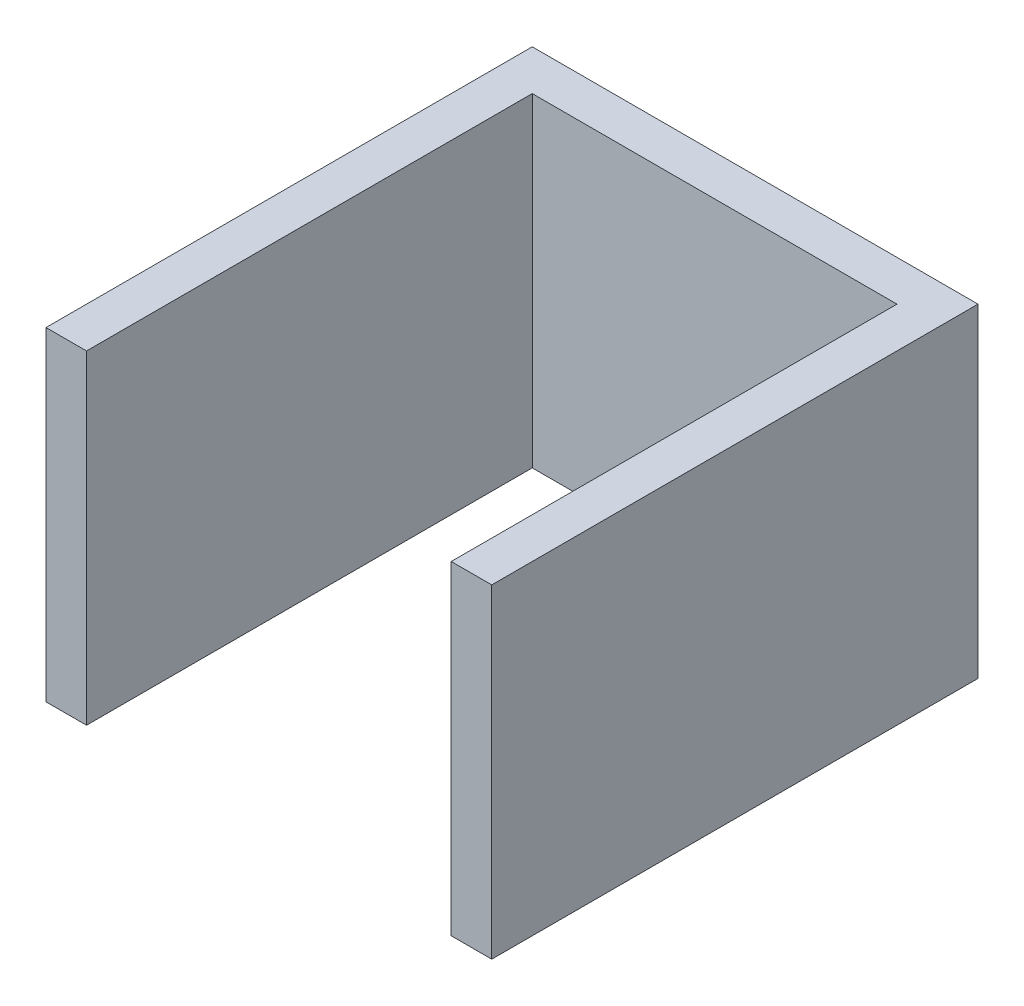
ISO-10303-21;
HEADER;
FILE_DESCRIPTION(('STEP AP214'),'2;1');
FILE_NAME('part.step','',(''),(''),'','','');
FILE_SCHEMA(('AUTOMOTIVE_DESIGN { 1 0 10303 214 1 1 1 1 }'));
ENDSEC;
DATA;
#1=APPLICATION_CONTEXT('core data for automotive mechanical design processes');
#2=APPLICATION_PROTOCOL_DEFINITION('international standard','automotive_design',2000,#1);
#3=PRODUCT_CONTEXT('',#1,'mechanical');
#4=PRODUCT('Part','Part','',(#3));
#5=PRODUCT_RELATED_PRODUCT_CATEGORY('part','',(#4));
#6=PRODUCT_DEFINITION_FORMATION('','',#4);
#7=PRODUCT_DEFINITION_CONTEXT('part definition',#1,'design');
#8=PRODUCT_DEFINITION('design','',#6,#7);
#9=PRODUCT_DEFINITION_SHAPE('','',#8);
#10=(LENGTH_UNIT() NAMED_UNIT(*) SI_UNIT(.MILLI.,.METRE.));
#11=(NAMED_UNIT(*) PLANE_ANGLE_UNIT() SI_UNIT($,.RADIAN.));
#12=(NAMED_UNIT(*) SI_UNIT($,.STERADIAN.) SOLID_ANGLE_UNIT());
#13=UNCERTAINTY_MEASURE_WITH_UNIT(LENGTH_MEASURE(1.E-05),#10,'distance_accuracy_value','');
#14=(GEOMETRIC_REPRESENTATION_CONTEXT(3) GLOBAL_UNCERTAINTY_ASSIGNED_CONTEXT((#13)) GLOBAL_UNIT_ASSIGNED_CONTEXT((#10,
#11,#12)) REPRESENTATION_CONTEXT('',''));
#15=CARTESIAN_POINT('',(0.,0.,0.));
#16=DIRECTION('',(0.,0.,1.));
#17=DIRECTION('',(1.,0.,0.));
#18=AXIS2_PLACEMENT_3D('',#15,#16,#17);
#19=CARTESIAN_POINT('',(-9.99999999999999,80.,0.));
#20=DIRECTION('',(0.,0.,-1.));
#21=DIRECTION('',(-1.,0.,0.));
#22=AXIS2_PLACEMENT_3D('',#19,#20,#21);
#23=PLANE('',#22);
#24=DIRECTION('',(1.,0.,0.));
#25=VECTOR('',#24,1.);
#26=CARTESIAN_POINT('',(-9.99999999999999,0.,0.));
#27=LINE('',#26,#25);
#28=CARTESIAN_POINT('',(-9.99999999999999,0.,0.));
#29=VERTEX_POINT('',#28);
#30=CARTESIAN_POINT('',(0.,0.,0.));
#31=VERTEX_POINT('',#30);
#32=EDGE_CURVE('E140',#29,#31,#27,.T.);
#33=ORIENTED_EDGE('',*,*,#32,.T.);
#34=DIRECTION('',(0.,-1.,0.));
#35=VECTOR('',#34,1.);
#36=CARTESIAN_POINT('',(0.,80.,0.));
#37=LINE('',#36,#35);
#38=CARTESIAN_POINT('',(0.,80.,0.));
#39=VERTEX_POINT('',#38);
#40=EDGE_CURVE('E11',#39,#31,#37,.T.);
#41=ORIENTED_EDGE('',*,*,#40,.F.);
#42=DIRECTION('',(1.,0.,0.));
#43=VECTOR('',#42,1.);
#44=CARTESIAN_POINT('',(-9.99999999999999,80.,0.));
#45=LINE('',#44,#43);
#46=CARTESIAN_POINT('',(-9.99999999999999,80.,0.));
#47=VERTEX_POINT('',#46);
#48=EDGE_CURVE('E162',#47,#39,#45,.T.);
#49=ORIENTED_EDGE('',*,*,#48,.F.);
#50=DIRECTION('',(0.,-1.,0.));
#51=VECTOR('',#50,1.);
#52=CARTESIAN_POINT('',(-9.99999999999999,80.,0.));
#53=LINE('',#52,#51);
#54=EDGE_CURVE('E136',#47,#29,#53,.T.);
#55=ORIENTED_EDGE('',*,*,#54,.T.);
#56=EDGE_LOOP('',(#33,#41,#49,#55));
#57=FACE_BOUND('',#56,.T.);
#58=ADVANCED_FACE('F39',(#57),#23,.F.);
#59=CARTESIAN_POINT('',(0.,80.,0.));
#60=DIRECTION('',(-1.,0.,0.));
#61=DIRECTION('',(0.,0.,1.));
#62=AXIS2_PLACEMENT_3D('',#59,#60,#61);
#63=PLANE('',#62);
#64=DIRECTION('',(0.,0.,-1.));
#65=VECTOR('',#64,1.);
#66=CARTESIAN_POINT('',(0.,0.,0.));
#67=LINE('',#66,#65);
#68=CARTESIAN_POINT('',(0.,0.,-120.));
#69=VERTEX_POINT('',#68);
#70=EDGE_CURVE('E144',#31,#69,#67,.T.);
#71=ORIENTED_EDGE('',*,*,#70,.T.);
#72=DIRECTION('',(0.,-1.,0.));
#73=VECTOR('',#72,1.);
#74=CARTESIAN_POINT('',(0.,80.,-120.));
#75=LINE('',#74,#73);
#76=CARTESIAN_POINT('',(0.,80.,-120.));
#77=VERTEX_POINT('',#76);
#78=EDGE_CURVE('E48',#77,#69,#75,.T.);
#79=ORIENTED_EDGE('',*,*,#78,.F.);
#80=DIRECTION('',(0.,0.,-1.));
#81=VECTOR('',#80,1.);
#82=CARTESIAN_POINT('',(0.,80.,0.));
#83=LINE('',#82,#81);
#84=EDGE_CURVE('E99',#39,#77,#83,.T.);
#85=ORIENTED_EDGE('',*,*,#84,.F.);
#86=ORIENTED_EDGE('',*,*,#40,.T.);
#87=EDGE_LOOP('',(#71,#79,#85,#86));
#88=FACE_BOUND('',#87,.T.);
#89=ADVANCED_FACE('F208',(#88),#63,.F.);
#90=CARTESIAN_POINT('',(0.,80.,-120.));
#91=DIRECTION('',(0.,0.,1.));
#92=DIRECTION('',(1.,0.,0.));
#93=AXIS2_PLACEMENT_3D('',#90,#91,#92);
#94=PLANE('',#93);
#95=DIRECTION('',(-1.,0.,0.));
#96=VECTOR('',#95,1.);
#97=CARTESIAN_POINT('',(0.,0.,-120.));
#98=LINE('',#97,#96);
#99=CARTESIAN_POINT('',(-110.,0.,-120.));
#100=VERTEX_POINT('',#99);
#101=EDGE_CURVE('E147',#69,#100,#98,.T.);
#102=ORIENTED_EDGE('',*,*,#101,.T.);
#103=DIRECTION('',(0.,-1.,0.));
#104=VECTOR('',#103,1.);
#105=CARTESIAN_POINT('',(-110.,80.,-120.));
#106=LINE('',#105,#104);
#107=CARTESIAN_POINT('',(-110.,80.,-120.));
#108=VERTEX_POINT('',#107);
#109=EDGE_CURVE('E173',#108,#100,#106,.T.);
#110=ORIENTED_EDGE('',*,*,#109,.F.);
#111=DIRECTION('',(-1.,0.,0.));
#112=VECTOR('',#111,1.);
#113=CARTESIAN_POINT('',(0.,80.,-120.));
#114=LINE('',#113,#112);
#115=EDGE_CURVE('E183',#77,#108,#114,.T.);
#116=ORIENTED_EDGE('',*,*,#115,.F.);
#117=ORIENTED_EDGE('',*,*,#78,.T.);
#118=EDGE_LOOP('',(#102,#110,#116,#117));
#119=FACE_BOUND('',#118,.T.);
#120=ADVANCED_FACE('F181',(#119),#94,.F.);
#121=CARTESIAN_POINT('',(-110.,80.,-120.));
#122=DIRECTION('',(1.,0.,0.));
#123=DIRECTION('',(0.,0.,-1.));
#124=AXIS2_PLACEMENT_3D('',#121,#122,#123);
#125=PLANE('',#124);
#126=DIRECTION('',(0.,0.,1.));
#127=VECTOR('',#126,1.);
#128=CARTESIAN_POINT('',(-110.,0.,-120.));
#129=LINE('',#128,#127);
#130=CARTESIAN_POINT('',(-110.,0.,0.));
#131=VERTEX_POINT('',#130);
#132=EDGE_CURVE('E150',#100,#131,#129,.T.);
#133=ORIENTED_EDGE('',*,*,#132,.T.);
#134=DIRECTION('',(0.,-1.,0.));
#135=VECTOR('',#134,1.);
#136=CARTESIAN_POINT('',(-110.,80.,0.));
#137=LINE('',#136,#135);
#138=CARTESIAN_POINT('',(-110.,80.,0.));
#139=VERTEX_POINT('',#138);
#140=EDGE_CURVE('E169',#139,#131,#137,.T.);
#141=ORIENTED_EDGE('',*,*,#140,.F.);
#142=DIRECTION('',(0.,0.,1.));
#143=VECTOR('',#142,1.);
#144=CARTESIAN_POINT('',(-110.,80.,-120.));
#145=LINE('',#144,#143);
#146=EDGE_CURVE('E196',#108,#139,#145,.T.);
#147=ORIENTED_EDGE('',*,*,#146,.F.);
#148=ORIENTED_EDGE('',*,*,#109,.T.);
#149=EDGE_LOOP('',(#133,#141,#147,#148));
#150=FACE_BOUND('',#149,.T.);
#151=ADVANCED_FACE('F191',(#150),#125,.F.);
#152=CARTESIAN_POINT('',(-110.,80.,0.));
#153=DIRECTION('',(0.,0.,-1.));
#154=DIRECTION('',(-1.,0.,0.));
#155=AXIS2_PLACEMENT_3D('',#152,#153,#154);
#156=PLANE('',#155);
#157=DIRECTION('',(1.,0.,0.));
#158=VECTOR('',#157,1.);
#159=CARTESIAN_POINT('',(-110.,0.,0.));
#160=LINE('',#159,#158);
#161=CARTESIAN_POINT('',(-100.,0.,0.));
#162=VERTEX_POINT('',#161);
#163=EDGE_CURVE('E153',#131,#162,#160,.T.);
#164=ORIENTED_EDGE('',*,*,#163,.T.);
#165=DIRECTION('',(0.,-1.,0.));
#166=VECTOR('',#165,1.);
#167=CARTESIAN_POINT('',(-100.,80.,0.));
#168=LINE('',#167,#166);
#169=CARTESIAN_POINT('',(-100.,80.,0.));
#170=VERTEX_POINT('',#169);
#171=EDGE_CURVE('E129',#170,#162,#168,.T.);
#172=ORIENTED_EDGE('',*,*,#171,.F.);
#173=DIRECTION('',(1.,0.,0.));
#174=VECTOR('',#173,1.);
#175=CARTESIAN_POINT('',(-110.,80.,0.));
#176=LINE('',#175,#174);
#177=EDGE_CURVE('E118',#139,#170,#176,.T.);
#178=ORIENTED_EDGE('',*,*,#177,.F.);
#179=ORIENTED_EDGE('',*,*,#140,.T.);
#180=EDGE_LOOP('',(#164,#172,#178,#179));
#181=FACE_BOUND('',#180,.T.);
#182=ADVANCED_FACE('F194',(#181),#156,.F.);
#183=CARTESIAN_POINT('',(-100.,80.,0.));
#184=DIRECTION('',(-1.,0.,0.));
#185=DIRECTION('',(0.,0.,1.));
#186=AXIS2_PLACEMENT_3D('',#183,#184,#185);
#187=PLANE('',#186);
#188=DIRECTION('',(0.,0.,-1.));
#189=VECTOR('',#188,1.);
#190=CARTESIAN_POINT('',(-100.,0.,0.));
#191=LINE('',#190,#189);
#192=CARTESIAN_POINT('',(-100.,0.,-110.));
#193=VERTEX_POINT('',#192);
#194=EDGE_CURVE('E127',#162,#193,#191,.T.);
#195=ORIENTED_EDGE('',*,*,#194,.T.);
#196=DIRECTION('',(0.,-1.,0.));
#197=VECTOR('',#196,1.);
#198=CARTESIAN_POINT('',(-100.,80.,-110.));
#199=LINE('',#198,#197);
#200=CARTESIAN_POINT('',(-100.,80.,-110.));
#201=VERTEX_POINT('',#200);
#202=EDGE_CURVE('E124',#201,#193,#199,.T.);
#203=ORIENTED_EDGE('',*,*,#202,.F.);
#204=DIRECTION('',(0.,0.,-1.));
#205=VECTOR('',#204,1.);
#206=CARTESIAN_POINT('',(-100.,80.,0.));
#207=LINE('',#206,#205);
#208=EDGE_CURVE('E112',#170,#201,#207,.T.);
#209=ORIENTED_EDGE('',*,*,#208,.F.);
#210=ORIENTED_EDGE('',*,*,#171,.T.);
#211=EDGE_LOOP('',(#195,#203,#209,#210));
#212=FACE_BOUND('',#211,.T.);
#213=ADVANCED_FACE('F125',(#212),#187,.F.);
#214=CARTESIAN_POINT('',(-100.,80.,-110.));
#215=DIRECTION('',(0.,0.,-1.));
#216=DIRECTION('',(-1.,0.,0.));
#217=AXIS2_PLACEMENT_3D('',#214,#215,#216);
#218=PLANE('',#217);
#219=DIRECTION('',(1.,0.,0.));
#220=VECTOR('',#219,1.);
#221=CARTESIAN_POINT('',(-100.,0.,-110.));
#222=LINE('',#221,#220);
#223=CARTESIAN_POINT('',(-9.99999999999999,0.,-110.));
#224=VERTEX_POINT('',#223);
#225=EDGE_CURVE('E85',#193,#224,#222,.T.);
#226=ORIENTED_EDGE('',*,*,#225,.T.);
#227=DIRECTION('',(0.,-1.,0.));
#228=VECTOR('',#227,1.);
#229=CARTESIAN_POINT('',(-9.99999999999999,80.,-110.));
#230=LINE('',#229,#228);
#231=CARTESIAN_POINT('',(-9.99999999999999,80.,-110.));
#232=VERTEX_POINT('',#231);
#233=EDGE_CURVE('E130',#232,#224,#230,.T.);
#234=ORIENTED_EDGE('',*,*,#233,.F.);
#235=DIRECTION('',(1.,0.,0.));
#236=VECTOR('',#235,1.);
#237=CARTESIAN_POINT('',(-100.,80.,-110.));
#238=LINE('',#237,#236);
#239=EDGE_CURVE('E116',#201,#232,#238,.T.);
#240=ORIENTED_EDGE('',*,*,#239,.F.);
#241=ORIENTED_EDGE('',*,*,#202,.T.);
#242=EDGE_LOOP('',(#226,#234,#240,#241));
#243=FACE_BOUND('',#242,.T.);
#244=ADVANCED_FACE('F132',(#243),#218,.F.);
#245=CARTESIAN_POINT('',(-9.99999999999999,80.,-110.));
#246=DIRECTION('',(1.,0.,0.));
#247=DIRECTION('',(0.,0.,-1.));
#248=AXIS2_PLACEMENT_3D('',#245,#246,#247);
#249=PLANE('',#248);
#250=DIRECTION('',(0.,0.,1.));
#251=VECTOR('',#250,1.);
#252=CARTESIAN_POINT('',(-9.99999999999999,0.,-110.));
#253=LINE('',#252,#251);
#254=EDGE_CURVE('E91',#224,#29,#253,.T.);
#255=ORIENTED_EDGE('',*,*,#254,.T.);
#256=ORIENTED_EDGE('',*,*,#54,.F.);
#257=DIRECTION('',(0.,0.,1.));
#258=VECTOR('',#257,1.);
#259=CARTESIAN_POINT('',(-9.99999999999999,80.,-110.));
#260=LINE('',#259,#258);
#261=EDGE_CURVE('E56',#232,#47,#260,.T.);
#262=ORIENTED_EDGE('',*,*,#261,.F.);
#263=ORIENTED_EDGE('',*,*,#233,.T.);
#264=EDGE_LOOP('',(#255,#256,#262,#263));
#265=FACE_BOUND('',#264,.T.);
#266=ADVANCED_FACE('F224',(#265),#249,.F.);
#267=CARTESIAN_POINT('',(0.,80.,0.));
#268=DIRECTION('',(0.,1.,0.));
#269=DIRECTION('',(0.,0.,1.));
#270=AXIS2_PLACEMENT_3D('',#267,#268,#269);
#271=PLANE('',#270);
#272=ORIENTED_EDGE('',*,*,#48,.T.);
#273=ORIENTED_EDGE('',*,*,#84,.T.);
#274=ORIENTED_EDGE('',*,*,#115,.T.);
#275=ORIENTED_EDGE('',*,*,#146,.T.);
#276=ORIENTED_EDGE('',*,*,#177,.T.);
#277=ORIENTED_EDGE('',*,*,#208,.T.);
#278=ORIENTED_EDGE('',*,*,#239,.T.);
#279=ORIENTED_EDGE('',*,*,#261,.T.);
#280=EDGE_LOOP('',(#272,#273,#274,#275,#276,#277,#278,#279));
#281=FACE_BOUND('',#280,.T.);
#282=ADVANCED_FACE('F114',(#281),#271,.T.);
#283=CARTESIAN_POINT('',(0.,0.,0.));
#284=DIRECTION('',(0.,1.,0.));
#285=DIRECTION('',(0.,0.,1.));
#286=AXIS2_PLACEMENT_3D('',#283,#284,#285);
#287=PLANE('',#286);
#288=ORIENTED_EDGE('',*,*,#32,.F.);
#289=ORIENTED_EDGE('',*,*,#254,.F.);
#290=ORIENTED_EDGE('',*,*,#225,.F.);
#291=ORIENTED_EDGE('',*,*,#194,.F.);
#292=ORIENTED_EDGE('',*,*,#163,.F.);
#293=ORIENTED_EDGE('',*,*,#132,.F.);
#294=ORIENTED_EDGE('',*,*,#101,.F.);
#295=ORIENTED_EDGE('',*,*,#70,.F.);
#296=EDGE_LOOP('',(#288,#289,#290,#291,#292,#293,#294,#295));
#297=FACE_BOUND('',#296,.T.);
#298=ADVANCED_FACE('F187',(#297),#287,.F.);
#299=CLOSED_SHELL('',(#58,#89,#120,#151,#182,#213,#244,#266,#282,#298));
#300=MANIFOLD_SOLID_BREP('B2',#299);
#301=ADVANCED_BREP_SHAPE_REPRESENTATION('',(#18,#300),#14);
#302=SHAPE_DEFINITION_REPRESENTATION(#9,#301);
ENDSEC;
END-ISO-10303-21;
